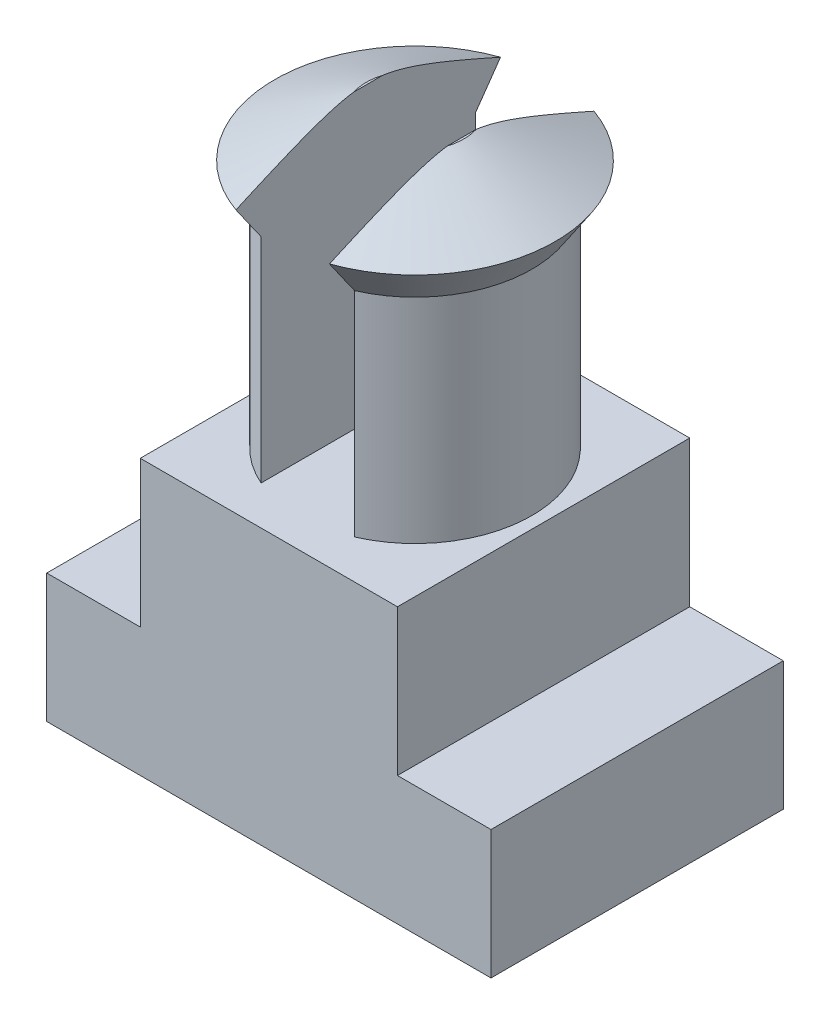
ISO-10303-21;
HEADER;
FILE_DESCRIPTION(('STEP AP214'),'2;1');
FILE_NAME('part.step','',(''),(''),'','','');
FILE_SCHEMA(('AUTOMOTIVE_DESIGN { 1 0 10303 214 1 1 1 1 }'));
ENDSEC;
DATA;
#1=APPLICATION_CONTEXT('core data for automotive mechanical design processes');
#2=APPLICATION_PROTOCOL_DEFINITION('international standard','automotive_design',2000,#1);
#3=PRODUCT_CONTEXT('',#1,'mechanical');
#4=PRODUCT('Part','Part','',(#3));
#5=PRODUCT_RELATED_PRODUCT_CATEGORY('part','',(#4));
#6=PRODUCT_DEFINITION_FORMATION('','',#4);
#7=PRODUCT_DEFINITION_CONTEXT('part definition',#1,'design');
#8=PRODUCT_DEFINITION('design','',#6,#7);
#9=PRODUCT_DEFINITION_SHAPE('','',#8);
#10=(LENGTH_UNIT() NAMED_UNIT(*) SI_UNIT(.MILLI.,.METRE.));
#11=(NAMED_UNIT(*) PLANE_ANGLE_UNIT() SI_UNIT($,.RADIAN.));
#12=(NAMED_UNIT(*) SI_UNIT($,.STERADIAN.) SOLID_ANGLE_UNIT());
#13=UNCERTAINTY_MEASURE_WITH_UNIT(LENGTH_MEASURE(1.E-05),#10,'distance_accuracy_value','');
#14=(GEOMETRIC_REPRESENTATION_CONTEXT(3) GLOBAL_UNCERTAINTY_ASSIGNED_CONTEXT((#13)) GLOBAL_UNIT_ASSIGNED_CONTEXT((#10,
#11,#12)) REPRESENTATION_CONTEXT('',''));
#15=CARTESIAN_POINT('',(0.,0.,0.));
#16=DIRECTION('',(0.,0.,1.));
#17=DIRECTION('',(1.,0.,0.));
#18=AXIS2_PLACEMENT_3D('',#15,#16,#17);
#19=CARTESIAN_POINT('',(4.826,5.969,0.));
#20=DIRECTION('',(0.,-1.,0.));
#21=DIRECTION('',(0.,0.,-1.));
#22=AXIS2_PLACEMENT_3D('',#19,#20,#21);
#23=CYLINDRICAL_SURFACE('',#22,2.54);
#24=CARTESIAN_POINT('',(4.826,10.6045,0.));
#25=DIRECTION('',(0.,-1.,0.));
#26=DIRECTION('',(0.,0.,-1.));
#27=AXIS2_PLACEMENT_3D('',#24,#25,#26);
#28=CIRCLE('',#27,2.54);
#29=CARTESIAN_POINT('',(5.842,10.6045,-2.32794845303757));
#30=VERTEX_POINT('',#29);
#31=CARTESIAN_POINT('',(5.842,10.6045,2.32794845303757));
#32=VERTEX_POINT('',#31);
#33=EDGE_CURVE('E206',#30,#32,#28,.T.);
#34=ORIENTED_EDGE('',*,*,#33,.T.);
#35=DIRECTION('',(0.,-1.,0.));
#36=VECTOR('',#35,1.);
#37=CARTESIAN_POINT('',(5.842,5.969,2.32794845303757));
#38=LINE('',#37,#36);
#39=CARTESIAN_POINT('',(5.842,5.969,2.32794845303757));
#40=VERTEX_POINT('',#39);
#41=EDGE_CURVE('E195',#32,#40,#38,.T.);
#42=ORIENTED_EDGE('',*,*,#41,.T.);
#43=CARTESIAN_POINT('',(4.826,5.969,0.));
#44=DIRECTION('',(0.,-1.,0.));
#45=DIRECTION('',(0.,0.,-1.));
#46=AXIS2_PLACEMENT_3D('',#43,#44,#45);
#47=CIRCLE('',#46,2.54);
#48=CARTESIAN_POINT('',(5.842,5.969,-2.32794845303757));
#49=VERTEX_POINT('',#48);
#50=EDGE_CURVE('E155',#49,#40,#47,.T.);
#51=ORIENTED_EDGE('',*,*,#50,.F.);
#52=DIRECTION('',(0.,-1.,0.));
#53=VECTOR('',#52,1.);
#54=CARTESIAN_POINT('',(5.842,5.969,-2.32794845303757));
#55=LINE('',#54,#53);
#56=EDGE_CURVE('E196',#49,#30,#55,.F.);
#57=ORIENTED_EDGE('',*,*,#56,.T.);
#58=EDGE_LOOP('',(#34,#42,#51,#57));
#59=FACE_BOUND('',#58,.T.);
#60=ADVANCED_FACE('F39',(#59),#23,.T.);
#61=CARTESIAN_POINT('',(4.826,11.3804812503924,0.));
#62=DIRECTION('',(0.,1.,0.));
#63=DIRECTION('',(0.,0.,1.));
#64=AXIS2_PLACEMENT_3D('',#61,#62,#63);
#65=CONICAL_SURFACE('',#64,3.048,0.579640665928093);
#66=CARTESIAN_POINT('',(4.826,11.3804812503924,0.));
#67=DIRECTION('',(0.,-1.,0.));
#68=DIRECTION('',(0.,0.,-1.));
#69=AXIS2_PLACEMENT_3D('',#66,#67,#68);
#70=CIRCLE('',#69,3.048);
#71=CARTESIAN_POINT('',(5.842,11.3804812503924,-2.87368195874213));
#72=VERTEX_POINT('',#71);
#73=CARTESIAN_POINT('',(5.842,11.3804812503924,2.87368195874213));
#74=VERTEX_POINT('',#73);
#75=EDGE_CURVE('E205',#72,#74,#70,.T.);
#76=ORIENTED_EDGE('',*,*,#75,.T.);
#77=CARTESIAN_POINT('',(5.842,11.3811812503924,2.87416801070969));
#78=CARTESIAN_POINT('',(5.842,11.2937430928275,2.81345351359968));
#79=CARTESIAN_POINT('',(5.842,11.2064033121465,2.75259787000958));
#80=CARTESIAN_POINT('',(5.842,11.0319659141862,2.63053603688743));
#81=CARTESIAN_POINT('',(5.842,10.9448683029176,2.56932983876808));
#82=CARTESIAN_POINT('',(5.842,10.683821494054,2.38495205207829));
#83=CARTESIAN_POINT('',(5.842,10.5103114048484,2.26115490095981));
#84=CARTESIAN_POINT('',(5.842,10.2489333358216,2.07166373403736));
#85=CARTESIAN_POINT('',(5.842,10.1603695963954,2.00692994088192));
#86=CARTESIAN_POINT('',(5.842,9.98391243494237,1.8765561166378));
#87=CARTESIAN_POINT('',(5.842,9.89601900133269,1.81091610126398));
#88=CARTESIAN_POINT('',(5.842,9.72118720453258,1.67846897460737));
#89=CARTESIAN_POINT('',(5.842,9.63424836018419,1.61166249983576));
#90=CARTESIAN_POINT('',(5.842,9.4616565011469,1.47641293947943));
#91=CARTESIAN_POINT('',(5.842,9.37600338298896,1.40796998675244));
#92=CARTESIAN_POINT('',(5.842,9.22835811364797,1.28661318364512));
#93=CARTESIAN_POINT('',(5.842,9.16593656388572,1.23422331306008));
#94=CARTESIAN_POINT('',(5.842,9.0425560015621,1.1276784887752));
#95=CARTESIAN_POINT('',(5.842,8.98159768894204,1.07352271845807));
#96=CARTESIAN_POINT('',(5.842,8.86223821544761,0.963136666078018));
#97=CARTESIAN_POINT('',(5.842,8.80382411431093,0.906920471949413));
#98=CARTESIAN_POINT('',(5.842,8.69041948713119,0.791165287316921));
#99=CARTESIAN_POINT('',(5.842,8.63542575448466,0.731629511375724));
#100=CARTESIAN_POINT('',(5.842,8.54715113353425,0.626595136933948));
#101=CARTESIAN_POINT('',(5.842,8.51237398065808,0.582372988912369));
#102=CARTESIAN_POINT('',(5.842,8.44699124706487,0.49074162642644));
#103=CARTESIAN_POINT('',(5.842,8.41639528993265,0.443325422500051));
#104=CARTESIAN_POINT('',(5.842,8.3613757618855,0.343655513722808));
#105=CARTESIAN_POINT('',(5.842,8.33707763212002,0.291328214534618));
#106=CARTESIAN_POINT('',(5.842,8.30887877361888,0.210083587394913));
#107=CARTESIAN_POINT('',(5.842,8.30086182196004,0.182601481346262));
#108=CARTESIAN_POINT('',(5.842,8.28805046398275,0.126906590329336));
#109=CARTESIAN_POINT('',(5.842,8.28325358253751,0.0986943839216304));
#110=CARTESIAN_POINT('',(5.842,8.27612128450013,0.030886728671197));
#111=CARTESIAN_POINT('',(5.842,8.27544975240734,-0.00890075946114833));
#112=CARTESIAN_POINT('',(5.842,8.28118529576405,-0.0879348288641458));
#113=CARTESIAN_POINT('',(5.842,8.28759423858431,-0.127181264675743));
#114=CARTESIAN_POINT('',(5.842,8.30945012445415,-0.216111694421217));
#115=CARTESIAN_POINT('',(5.842,8.32708915575657,-0.26524263162961));
#116=CARTESIAN_POINT('',(5.842,8.3697492151698,-0.360247989681236));
#117=CARTESIAN_POINT('',(5.842,8.39480182696169,-0.406107413943879));
#118=CARTESIAN_POINT('',(5.842,8.46076024930822,-0.51266978267417));
#119=CARTESIAN_POINT('',(5.842,8.50398541508686,-0.571903043867218));
#120=CARTESIAN_POINT('',(5.842,8.59582054368402,-0.686102097326208));
#121=CARTESIAN_POINT('',(5.842,8.64444404795528,-0.74105654157401));
#122=CARTESIAN_POINT('',(5.842,8.74556099639781,-0.848514378541095));
#123=CARTESIAN_POINT('',(5.842,8.79809429278485,-0.900979863865508));
#124=CARTESIAN_POINT('',(5.842,8.90525752633175,-1.00355584135168));
#125=CARTESIAN_POINT('',(5.842,8.95988471696029,-1.05366923880323));
#126=CARTESIAN_POINT('',(5.842,9.11114873191836,-1.18832716762505));
#127=CARTESIAN_POINT('',(5.842,9.20925553577792,-1.27121254717088));
#128=CARTESIAN_POINT('',(5.842,9.4079964399635,-1.43391028899564));
#129=CARTESIAN_POINT('',(5.842,9.50863131096992,-1.51372169492155));
#130=CARTESIAN_POINT('',(5.842,9.7116785035344,-1.6713953483683));
#131=CARTESIAN_POINT('',(5.842,9.81409348256069,-1.7492541645526));
#132=CARTESIAN_POINT('',(5.842,10.0199985234036,-1.90350101576025));
#133=CARTESIAN_POINT('',(5.842,10.1234884369936,-1.97988924952901));
#134=CARTESIAN_POINT('',(5.842,10.3227137077663,-2.12537085969966));
#135=CARTESIAN_POINT('',(5.842,10.4183879204228,-2.19454812568792));
#136=CARTESIAN_POINT('',(5.842,10.6102354710183,-2.33221472999728));
#137=CARTESIAN_POINT('',(5.842,10.7064088297158,-2.40070403935429));
#138=CARTESIAN_POINT('',(5.842,10.8988473148061,-2.53693573080637));
#139=CARTESIAN_POINT('',(5.842,10.9951112883497,-2.60467974326354));
#140=CARTESIAN_POINT('',(5.842,11.1879388148419,-2.73972754108189));
#141=CARTESIAN_POINT('',(5.842,11.2845023489719,-2.80703135330302));
#142=CARTESIAN_POINT('',(5.842,11.3811812503924,-2.87416801070969));
#143=B_SPLINE_CURVE_WITH_KNOTS('',3,(#77,#78,#79,#80,#81,#82,#83,#84,#85,#86,#87,#88,#89,#90,
#91,#92,#93,#94,#95,#96,#97,#98,#99,#100,#101,#102,#103,#104,#105,#106,#107,#108,#109,#110,#111,
#112,#113,#114,#115,#116,#117,#118,#119,#120,#121,#122,#123,#124,#125,#126,#127,#128,#129,#130,
#131,#132,#133,#134,#135,#136,#137,#138,#139,#140,#141,#142),.UNSPECIFIED.,.F.,.F.,(4,2,2,2,2,2,
2,2,2,2,2,2,2,2,2,2,2,2,2,2,2,2,2,2,2,2,2,2,2,2,2,2,4),(0.,0.319350196006104,0.638708248672975,
1.27812878335498,1.60722355886593,1.93631263467794,2.26522742312939,2.59411559864793,
2.83857382696774,3.08314675136386,3.32628001746737,3.5691817986144,3.7377867161726,
3.90677338986213,4.0789043665316,4.16462359097545,4.25027685113195,4.36897897017325,
4.48771240262152,4.64339895909547,4.79975856907374,5.01915681481184,5.23911840502718,
5.46175337702622,5.6841056957973,6.06928145767527,6.45457610037571,6.84050612025236,
7.22638361125301,7.58057099128558,7.93477322120012,8.28790651290895,8.64101805241183),.UNSPECIFIED.);
#144=EDGE_CURVE('E311',#74,#32,#143,.T.);
#145=ORIENTED_EDGE('',*,*,#144,.T.);
#146=ORIENTED_EDGE('',*,*,#33,.F.);
#147=EDGE_CURVE('E307',#30,#72,#143,.T.);
#148=ORIENTED_EDGE('',*,*,#147,.T.);
#149=EDGE_LOOP('',(#76,#145,#146,#148));
#150=FACE_BOUND('',#149,.T.);
#151=ADVANCED_FACE('F247',(#150),#65,.T.);
#152=CARTESIAN_POINT('',(4.826,12.319,0.));
#153=DIRECTION('',(0.,-1.,0.));
#154=DIRECTION('',(0.,0.,-1.));
#155=AXIS2_PLACEMENT_3D('',#152,#153,#154);
#156=CONICAL_SURFACE('',#155,1.06380352993122,1.1289836207384);
#157=ORIENTED_EDGE('',*,*,#75,.F.);
#158=CARTESIAN_POINT('',(5.842,11.3797812503924,-2.87525160882891));
#159=CARTESIAN_POINT('',(5.842,11.4148578710153,-2.79658769749822));
#160=CARTESIAN_POINT('',(5.842,11.4498098668399,-2.71786775586673));
#161=CARTESIAN_POINT('',(5.842,11.519375545832,-2.56027756916402));
#162=CARTESIAN_POINT('',(5.842,11.5539892252704,-2.48140732244747));
#163=CARTESIAN_POINT('',(5.842,11.6228623307408,-2.32331038031065));
#164=CARTESIAN_POINT('',(5.842,11.6571208360109,-2.24408328313405));
#165=CARTESIAN_POINT('',(5.842,11.7250726072754,-2.08538582871036));
#166=CARTESIAN_POINT('',(5.842,11.7587658682106,-2.00591546929348));
#167=CARTESIAN_POINT('',(5.842,11.8278721465587,-1.84073773539755));
#168=CARTESIAN_POINT('',(5.842,11.8632268152477,-1.75500587510974));
#169=CARTESIAN_POINT('',(5.842,11.9327046287167,-1.58304516230339));
#170=CARTESIAN_POINT('',(5.842,11.9668278125262,-1.49681632563609));
#171=CARTESIAN_POINT('',(5.842,12.0332484445713,-1.3237477278445));
#172=CARTESIAN_POINT('',(5.842,12.0655475965046,-1.2369086249398));
#173=CARTESIAN_POINT('',(5.842,12.1274574996447,-1.06224133881124));
#174=CARTESIAN_POINT('',(5.842,12.1570676876727,-0.974412952700807));
#175=CARTESIAN_POINT('',(5.842,12.2080197975583,-0.81049560214201));
#176=CARTESIAN_POINT('',(5.842,12.2299369991471,-0.734588380372099));
#177=CARTESIAN_POINT('',(5.842,12.2692665777364,-0.58163618053712));
#178=CARTESIAN_POINT('',(5.842,12.2866820067487,-0.50459201093124));
#179=CARTESIAN_POINT('',(5.842,12.3148320994506,-0.350907142789266));
#180=CARTESIAN_POINT('',(5.842,12.3256989339138,-0.274291736414112));
#181=CARTESIAN_POINT('',(5.842,12.3395627534811,-0.120367488563187));
#182=CARTESIAN_POINT('',(5.842,12.3425657322972,-0.0430592203010383));
#183=CARTESIAN_POINT('',(5.842,12.3401049559962,0.111886435275741));
#184=CARTESIAN_POINT('',(5.842,12.3345893558103,0.189522947339681));
#185=CARTESIAN_POINT('',(5.842,12.3160656174265,0.343914929439504));
#186=CARTESIAN_POINT('',(5.842,12.3030507327096,0.420669542601139));
#187=CARTESIAN_POINT('',(5.842,12.2710743305129,0.574601482661408));
#188=CARTESIAN_POINT('',(5.842,12.2519912247148,0.65175255047283));
#189=CARTESIAN_POINT('',(5.842,12.2097715732669,0.804954746299354));
#190=CARTESIAN_POINT('',(5.842,12.1866327617761,0.881005233594822));
#191=CARTESIAN_POINT('',(5.842,12.1345736408655,1.04156497914603));
#192=CARTESIAN_POINT('',(5.842,12.1052922157633,1.12595547839691));
#193=CARTESIAN_POINT('',(5.842,12.044460042711,1.29388514575467));
#194=CARTESIAN_POINT('',(5.842,12.0129097420777,1.37742447798442));
#195=CARTESIAN_POINT('',(5.842,11.9482411117081,1.54396539969459));
#196=CARTESIAN_POINT('',(5.842,11.9151215795298,1.62696651953728));
#197=CARTESIAN_POINT('',(5.842,11.8477977277604,1.79252862778497));
#198=CARTESIAN_POINT('',(5.842,11.8135933741461,1.87508960229067));
#199=CARTESIAN_POINT('',(5.842,11.7143841232767,2.111425927219));
#200=CARTESIAN_POINT('',(5.842,11.6484202593615,2.26479799693499));
#201=CARTESIAN_POINT('',(5.842,11.5483706406398,2.49421579987554));
#202=CARTESIAN_POINT('',(5.842,11.514865649762,2.57051730919712));
#203=CARTESIAN_POINT('',(5.842,11.4475414313361,2.72298105424714));
#204=CARTESIAN_POINT('',(5.842,11.4137222057647,2.79914329084807));
#205=CARTESIAN_POINT('',(5.842,11.3797812503924,2.87525160882891));
#206=B_SPLINE_CURVE_WITH_KNOTS('',3,(#158,#159,#160,#161,#162,#163,#164,#165,#166,#167,#168,
#169,#170,#171,#172,#173,#174,#175,#176,#177,#178,#179,#180,#181,#182,#183,#184,#185,#186,#187,
#188,#189,#190,#191,#192,#193,#194,#195,#196,#197,#198,#199,#200,#201,#202,#203,#204,#205),
.UNSPECIFIED.,.F.,.F.,(4,2,2,2,2,2,2,2,2,2,2,2,2,2,2,2,2,2,2,2,2,2,2,4),(0.,0.258390578281944,
0.516784001487421,0.775732516121167,1.03468334723917,1.31288393639803,1.59107570081887,
1.869003175948,2.14698872683465,2.38392259281447,2.62069540382926,2.85251369592627,
3.08415524812441,3.31721216335716,3.55047906971493,3.78875047014309,4.02715541477883,
4.29508343169943,4.5629587697207,4.83104279909052,5.09913524468802,5.59998374460687,
5.84998473450169,6.09998415284586),.UNSPECIFIED.);
#207=CARTESIAN_POINT('',(5.842,12.319,-0.315312464539752));
#208=VERTEX_POINT('',#207);
#209=EDGE_CURVE('E328',#72,#208,#206,.T.);
#210=ORIENTED_EDGE('',*,*,#209,.T.);
#211=CARTESIAN_POINT('',(4.826,12.319,0.));
#212=DIRECTION('',(0.,-1.,0.));
#213=DIRECTION('',(0.,0.,-1.));
#214=AXIS2_PLACEMENT_3D('',#211,#212,#213);
#215=CIRCLE('',#214,1.06380352993122);
#216=CARTESIAN_POINT('',(5.842,12.319,0.315312464539752));
#217=VERTEX_POINT('',#216);
#218=EDGE_CURVE('E194',#208,#217,#215,.T.);
#219=ORIENTED_EDGE('',*,*,#218,.T.);
#220=EDGE_CURVE('E329',#217,#74,#206,.T.);
#221=ORIENTED_EDGE('',*,*,#220,.T.);
#222=EDGE_LOOP('',(#157,#210,#219,#221));
#223=FACE_BOUND('',#222,.T.);
#224=ADVANCED_FACE('F255',(#223),#156,.T.);
#225=CARTESIAN_POINT('',(3.76219647006878,12.319,0.));
#226=DIRECTION('',(0.,-1.,0.));
#227=DIRECTION('',(0.,0.,-1.));
#228=AXIS2_PLACEMENT_3D('',#225,#226,#227);
#229=PLANE('',#228);
#230=ORIENTED_EDGE('',*,*,#218,.F.);
#231=DIRECTION('',(0.,0.,1.));
#232=VECTOR('',#231,1.);
#233=CARTESIAN_POINT('',(5.842,12.319,0.));
#234=LINE('',#233,#232);
#235=EDGE_CURVE('E11',#208,#217,#234,.T.);
#236=ORIENTED_EDGE('',*,*,#235,.T.);
#237=EDGE_LOOP('',(#230,#236));
#238=FACE_BOUND('',#237,.T.);
#239=ADVANCED_FACE('F347',(#238),#229,.F.);
#240=CARTESIAN_POINT('',(0.,0.,3.175));
#241=DIRECTION('',(1.,0.,0.));
#242=DIRECTION('',(0.,0.,-1.));
#243=AXIS2_PLACEMENT_3D('',#240,#241,#242);
#244=PLANE('',#243);
#245=DIRECTION('',(0.,-1.,0.));
#246=VECTOR('',#245,1.);
#247=CARTESIAN_POINT('',(0.,0.,-3.175));
#248=LINE('',#247,#246);
#249=CARTESIAN_POINT('',(0.,2.794,-3.175));
#250=VERTEX_POINT('',#249);
#251=CARTESIAN_POINT('',(0.,0.,-3.175));
#252=VERTEX_POINT('',#251);
#253=EDGE_CURVE('E146',#250,#252,#248,.T.);
#254=ORIENTED_EDGE('',*,*,#253,.T.);
#255=DIRECTION('',(0.,0.,-1.));
#256=VECTOR('',#255,1.);
#257=CARTESIAN_POINT('',(0.,0.,3.175));
#258=LINE('',#257,#256);
#259=CARTESIAN_POINT('',(0.,0.,3.175));
#260=VERTEX_POINT('',#259);
#261=EDGE_CURVE('E179',#260,#252,#258,.T.);
#262=ORIENTED_EDGE('',*,*,#261,.F.);
#263=DIRECTION('',(0.,-1.,0.));
#264=VECTOR('',#263,1.);
#265=CARTESIAN_POINT('',(0.,0.,3.175));
#266=LINE('',#265,#264);
#267=CARTESIAN_POINT('',(0.,2.794,3.175));
#268=VERTEX_POINT('',#267);
#269=EDGE_CURVE('E163',#268,#260,#266,.T.);
#270=ORIENTED_EDGE('',*,*,#269,.F.);
#271=DIRECTION('',(0.,0.,-1.));
#272=VECTOR('',#271,1.);
#273=CARTESIAN_POINT('',(0.,2.794,3.175));
#274=LINE('',#273,#272);
#275=EDGE_CURVE('E145',#268,#250,#274,.T.);
#276=ORIENTED_EDGE('',*,*,#275,.T.);
#277=EDGE_LOOP('',(#254,#262,#270,#276));
#278=FACE_BOUND('',#277,.T.);
#279=ADVANCED_FACE('F41',(#278),#244,.F.);
#280=CARTESIAN_POINT('',(0.,0.,3.175));
#281=DIRECTION('',(0.,1.,0.));
#282=DIRECTION('',(0.,0.,1.));
#283=AXIS2_PLACEMENT_3D('',#280,#281,#282);
#284=PLANE('',#283);
#285=DIRECTION('',(1.,0.,0.));
#286=VECTOR('',#285,1.);
#287=CARTESIAN_POINT('',(0.,0.,-3.175));
#288=LINE('',#287,#286);
#289=CARTESIAN_POINT('',(9.652,0.,-3.175));
#290=VERTEX_POINT('',#289);
#291=EDGE_CURVE('E151',#252,#290,#288,.T.);
#292=ORIENTED_EDGE('',*,*,#291,.T.);
#293=DIRECTION('',(0.,0.,-1.));
#294=VECTOR('',#293,1.);
#295=CARTESIAN_POINT('',(9.652,0.,3.175));
#296=LINE('',#295,#294);
#297=CARTESIAN_POINT('',(9.652,0.,3.175));
#298=VERTEX_POINT('',#297);
#299=EDGE_CURVE('E173',#298,#290,#296,.T.);
#300=ORIENTED_EDGE('',*,*,#299,.F.);
#301=DIRECTION('',(1.,0.,0.));
#302=VECTOR('',#301,1.);
#303=CARTESIAN_POINT('',(0.,0.,3.175));
#304=LINE('',#303,#302);
#305=EDGE_CURVE('E104',#260,#298,#304,.T.);
#306=ORIENTED_EDGE('',*,*,#305,.F.);
#307=ORIENTED_EDGE('',*,*,#261,.T.);
#308=EDGE_LOOP('',(#292,#300,#306,#307));
#309=FACE_BOUND('',#308,.T.);
#310=ADVANCED_FACE('F231',(#309),#284,.F.);
#311=CARTESIAN_POINT('',(9.652,2.794,3.175));
#312=DIRECTION('',(-1.,0.,0.));
#313=DIRECTION('',(0.,0.,1.));
#314=AXIS2_PLACEMENT_3D('',#311,#312,#313);
#315=PLANE('',#314);
#316=DIRECTION('',(0.,1.,0.));
#317=VECTOR('',#316,1.);
#318=CARTESIAN_POINT('',(9.652,2.794,-3.175));
#319=LINE('',#318,#317);
#320=CARTESIAN_POINT('',(9.652,2.794,-3.175));
#321=VERTEX_POINT('',#320);
#322=EDGE_CURVE('E152',#290,#321,#319,.T.);
#323=ORIENTED_EDGE('',*,*,#322,.T.);
#324=DIRECTION('',(0.,0.,-1.));
#325=VECTOR('',#324,1.);
#326=CARTESIAN_POINT('',(9.652,2.794,3.175));
#327=LINE('',#326,#325);
#328=CARTESIAN_POINT('',(9.652,2.794,3.175));
#329=VERTEX_POINT('',#328);
#330=EDGE_CURVE('E171',#329,#321,#327,.T.);
#331=ORIENTED_EDGE('',*,*,#330,.F.);
#332=DIRECTION('',(0.,1.,0.));
#333=VECTOR('',#332,1.);
#334=CARTESIAN_POINT('',(9.652,2.794,3.175));
#335=LINE('',#334,#333);
#336=EDGE_CURVE('E212',#298,#329,#335,.T.);
#337=ORIENTED_EDGE('',*,*,#336,.F.);
#338=ORIENTED_EDGE('',*,*,#299,.T.);
#339=EDGE_LOOP('',(#323,#331,#337,#338));
#340=FACE_BOUND('',#339,.T.);
#341=ADVANCED_FACE('F240',(#340),#315,.F.);
#342=CARTESIAN_POINT('',(7.62,2.794,3.175));
#343=DIRECTION('',(0.,-1.,0.));
#344=DIRECTION('',(0.,0.,-1.));
#345=AXIS2_PLACEMENT_3D('',#342,#343,#344);
#346=PLANE('',#345);
#347=DIRECTION('',(-1.,0.,0.));
#348=VECTOR('',#347,1.);
#349=CARTESIAN_POINT('',(7.62,2.794,-3.175));
#350=LINE('',#349,#348);
#351=CARTESIAN_POINT('',(7.62,2.794,-3.175));
#352=VERTEX_POINT('',#351);
#353=EDGE_CURVE('E156',#321,#352,#350,.T.);
#354=ORIENTED_EDGE('',*,*,#353,.T.);
#355=DIRECTION('',(0.,0.,-1.));
#356=VECTOR('',#355,1.);
#357=CARTESIAN_POINT('',(7.62,2.794,3.175));
#358=LINE('',#357,#356);
#359=CARTESIAN_POINT('',(7.62,2.794,3.175));
#360=VERTEX_POINT('',#359);
#361=EDGE_CURVE('E169',#360,#352,#358,.T.);
#362=ORIENTED_EDGE('',*,*,#361,.F.);
#363=DIRECTION('',(-1.,0.,0.));
#364=VECTOR('',#363,1.);
#365=CARTESIAN_POINT('',(7.62,2.794,3.175));
#366=LINE('',#365,#364);
#367=EDGE_CURVE('E216',#329,#360,#366,.T.);
#368=ORIENTED_EDGE('',*,*,#367,.F.);
#369=ORIENTED_EDGE('',*,*,#330,.T.);
#370=EDGE_LOOP('',(#354,#362,#368,#369));
#371=FACE_BOUND('',#370,.T.);
#372=ADVANCED_FACE('F225',(#371),#346,.F.);
#373=CARTESIAN_POINT('',(7.62,5.969,3.175));
#374=DIRECTION('',(-1.,0.,0.));
#375=DIRECTION('',(0.,0.,1.));
#376=AXIS2_PLACEMENT_3D('',#373,#374,#375);
#377=PLANE('',#376);
#378=DIRECTION('',(0.,1.,0.));
#379=VECTOR('',#378,1.);
#380=CARTESIAN_POINT('',(7.62,5.969,-3.175));
#381=LINE('',#380,#379);
#382=CARTESIAN_POINT('',(7.62,5.969,-3.175));
#383=VERTEX_POINT('',#382);
#384=EDGE_CURVE('E158',#352,#383,#381,.T.);
#385=ORIENTED_EDGE('',*,*,#384,.T.);
#386=DIRECTION('',(0.,0.,-1.));
#387=VECTOR('',#386,1.);
#388=CARTESIAN_POINT('',(7.62,5.969,3.175));
#389=LINE('',#388,#387);
#390=CARTESIAN_POINT('',(7.62,5.969,3.175));
#391=VERTEX_POINT('',#390);
#392=EDGE_CURVE('E136',#391,#383,#389,.T.);
#393=ORIENTED_EDGE('',*,*,#392,.F.);
#394=DIRECTION('',(0.,1.,0.));
#395=VECTOR('',#394,1.);
#396=CARTESIAN_POINT('',(7.62,5.969,3.175));
#397=LINE('',#396,#395);
#398=EDGE_CURVE('E130',#360,#391,#397,.T.);
#399=ORIENTED_EDGE('',*,*,#398,.F.);
#400=ORIENTED_EDGE('',*,*,#361,.T.);
#401=EDGE_LOOP('',(#385,#393,#399,#400));
#402=FACE_BOUND('',#401,.T.);
#403=ADVANCED_FACE('F226',(#402),#377,.F.);
#404=CARTESIAN_POINT('',(2.032,5.969,3.175));
#405=DIRECTION('',(0.,-1.,0.));
#406=DIRECTION('',(0.,0.,-1.));
#407=AXIS2_PLACEMENT_3D('',#404,#405,#406);
#408=PLANE('',#407);
#409=DIRECTION('',(0.,0.,1.));
#410=VECTOR('',#409,1.);
#411=CARTESIAN_POINT('',(3.81,5.969,-3.175));
#412=LINE('',#411,#410);
#413=CARTESIAN_POINT('',(3.81,5.969,-2.32794845303757));
#414=VERTEX_POINT('',#413);
#415=CARTESIAN_POINT('',(3.81,5.969,2.32794845303757));
#416=VERTEX_POINT('',#415);
#417=EDGE_CURVE('E359',#414,#416,#412,.T.);
#418=ORIENTED_EDGE('',*,*,#417,.T.);
#419=EDGE_CURVE('E207',#416,#414,#47,.T.);
#420=ORIENTED_EDGE('',*,*,#419,.T.);
#421=EDGE_LOOP('',(#418,#420));
#422=FACE_BOUND('',#421,.T.);
#423=ORIENTED_EDGE('',*,*,#50,.T.);
#424=DIRECTION('',(0.,0.,1.));
#425=VECTOR('',#424,1.);
#426=CARTESIAN_POINT('',(5.842,5.969,-3.175));
#427=LINE('',#426,#425);
#428=EDGE_CURVE('E320',#49,#40,#427,.T.);
#429=ORIENTED_EDGE('',*,*,#428,.F.);
#430=EDGE_LOOP('',(#423,#429));
#431=FACE_BOUND('',#430,.T.);
#432=DIRECTION('',(-1.,0.,0.));
#433=VECTOR('',#432,1.);
#434=CARTESIAN_POINT('',(2.032,5.969,-3.175));
#435=LINE('',#434,#433);
#436=CARTESIAN_POINT('',(2.032,5.969,-3.175));
#437=VERTEX_POINT('',#436);
#438=EDGE_CURVE('E137',#383,#437,#435,.T.);
#439=ORIENTED_EDGE('',*,*,#438,.T.);
#440=DIRECTION('',(0.,0.,-1.));
#441=VECTOR('',#440,1.);
#442=CARTESIAN_POINT('',(2.032,5.969,3.175));
#443=LINE('',#442,#441);
#444=CARTESIAN_POINT('',(2.032,5.969,3.175));
#445=VERTEX_POINT('',#444);
#446=EDGE_CURVE('E134',#445,#437,#443,.T.);
#447=ORIENTED_EDGE('',*,*,#446,.F.);
#448=DIRECTION('',(-1.,0.,0.));
#449=VECTOR('',#448,1.);
#450=CARTESIAN_POINT('',(2.032,5.969,3.175));
#451=LINE('',#450,#449);
#452=EDGE_CURVE('E120',#391,#445,#451,.T.);
#453=ORIENTED_EDGE('',*,*,#452,.F.);
#454=ORIENTED_EDGE('',*,*,#392,.T.);
#455=EDGE_LOOP('',(#439,#447,#453,#454));
#456=FACE_BOUND('',#455,.T.);
#457=ADVANCED_FACE('F133',(#422,#431,#456),#408,.F.);
#458=CARTESIAN_POINT('',(2.032,2.794,3.175));
#459=DIRECTION('',(1.,0.,0.));
#460=DIRECTION('',(0.,0.,-1.));
#461=AXIS2_PLACEMENT_3D('',#458,#459,#460);
#462=PLANE('',#461);
#463=DIRECTION('',(0.,-1.,0.));
#464=VECTOR('',#463,1.);
#465=CARTESIAN_POINT('',(2.032,2.794,-3.175));
#466=LINE('',#465,#464);
#467=CARTESIAN_POINT('',(2.032,2.794,-3.175));
#468=VERTEX_POINT('',#467);
#469=EDGE_CURVE('E161',#437,#468,#466,.T.);
#470=ORIENTED_EDGE('',*,*,#469,.T.);
#471=DIRECTION('',(0.,0.,-1.));
#472=VECTOR('',#471,1.);
#473=CARTESIAN_POINT('',(2.032,2.794,3.175));
#474=LINE('',#473,#472);
#475=CARTESIAN_POINT('',(2.032,2.794,3.175));
#476=VERTEX_POINT('',#475);
#477=EDGE_CURVE('E138',#476,#468,#474,.T.);
#478=ORIENTED_EDGE('',*,*,#477,.F.);
#479=DIRECTION('',(0.,-1.,0.));
#480=VECTOR('',#479,1.);
#481=CARTESIAN_POINT('',(2.032,2.794,3.175));
#482=LINE('',#481,#480);
#483=EDGE_CURVE('E121',#445,#476,#482,.T.);
#484=ORIENTED_EDGE('',*,*,#483,.F.);
#485=ORIENTED_EDGE('',*,*,#446,.T.);
#486=EDGE_LOOP('',(#470,#478,#484,#485));
#487=FACE_BOUND('',#486,.T.);
#488=ADVANCED_FACE('F142',(#487),#462,.F.);
#489=CARTESIAN_POINT('',(0.,2.794,3.175));
#490=DIRECTION('',(0.,-1.,0.));
#491=DIRECTION('',(0.,0.,-1.));
#492=AXIS2_PLACEMENT_3D('',#489,#490,#491);
#493=PLANE('',#492);
#494=DIRECTION('',(-1.,0.,0.));
#495=VECTOR('',#494,1.);
#496=CARTESIAN_POINT('',(0.,2.794,-3.175));
#497=LINE('',#496,#495);
#498=EDGE_CURVE('E96',#468,#250,#497,.T.);
#499=ORIENTED_EDGE('',*,*,#498,.T.);
#500=ORIENTED_EDGE('',*,*,#275,.F.);
#501=DIRECTION('',(-1.,0.,0.));
#502=VECTOR('',#501,1.);
#503=CARTESIAN_POINT('',(0.,2.794,3.175));
#504=LINE('',#503,#502);
#505=EDGE_CURVE('E64',#476,#268,#504,.T.);
#506=ORIENTED_EDGE('',*,*,#505,.F.);
#507=ORIENTED_EDGE('',*,*,#477,.T.);
#508=EDGE_LOOP('',(#499,#500,#506,#507));
#509=FACE_BOUND('',#508,.T.);
#510=ADVANCED_FACE('F230',(#509),#493,.F.);
#511=CARTESIAN_POINT('',(0.,0.,3.175));
#512=DIRECTION('',(0.,0.,-1.));
#513=DIRECTION('',(-1.,0.,0.));
#514=AXIS2_PLACEMENT_3D('',#511,#512,#513);
#515=PLANE('',#514);
#516=ORIENTED_EDGE('',*,*,#269,.T.);
#517=ORIENTED_EDGE('',*,*,#305,.T.);
#518=ORIENTED_EDGE('',*,*,#336,.T.);
#519=ORIENTED_EDGE('',*,*,#367,.T.);
#520=ORIENTED_EDGE('',*,*,#398,.T.);
#521=ORIENTED_EDGE('',*,*,#452,.T.);
#522=ORIENTED_EDGE('',*,*,#483,.T.);
#523=ORIENTED_EDGE('',*,*,#505,.T.);
#524=EDGE_LOOP('',(#516,#517,#518,#519,#520,#521,#522,#523));
#525=FACE_BOUND('',#524,.T.);
#526=ADVANCED_FACE('F124',(#525),#515,.F.);
#527=CARTESIAN_POINT('',(0.,0.,-3.175));
#528=DIRECTION('',(0.,0.,-1.));
#529=DIRECTION('',(-1.,0.,0.));
#530=AXIS2_PLACEMENT_3D('',#527,#528,#529);
#531=PLANE('',#530);
#532=ORIENTED_EDGE('',*,*,#253,.F.);
#533=ORIENTED_EDGE('',*,*,#498,.F.);
#534=ORIENTED_EDGE('',*,*,#469,.F.);
#535=ORIENTED_EDGE('',*,*,#438,.F.);
#536=ORIENTED_EDGE('',*,*,#384,.F.);
#537=ORIENTED_EDGE('',*,*,#353,.F.);
#538=ORIENTED_EDGE('',*,*,#322,.F.);
#539=ORIENTED_EDGE('',*,*,#291,.F.);
#540=EDGE_LOOP('',(#532,#533,#534,#535,#536,#537,#538,#539));
#541=FACE_BOUND('',#540,.T.);
#542=ADVANCED_FACE('F228',(#541),#531,.T.);
#543=CARTESIAN_POINT('',(3.81,10.6045,2.32794845303757));
#544=VERTEX_POINT('',#543);
#545=CARTESIAN_POINT('',(3.81,10.6045,-2.32794845303757));
#546=VERTEX_POINT('',#545);
#547=EDGE_CURVE('E202',#544,#546,#28,.T.);
#548=ORIENTED_EDGE('',*,*,#547,.T.);
#549=DIRECTION('',(0.,-1.,0.));
#550=VECTOR('',#549,1.);
#551=CARTESIAN_POINT('',(3.81,5.969,-2.32794845303757));
#552=LINE('',#551,#550);
#553=EDGE_CURVE('E274',#546,#414,#552,.T.);
#554=ORIENTED_EDGE('',*,*,#553,.T.);
#555=ORIENTED_EDGE('',*,*,#419,.F.);
#556=DIRECTION('',(0.,-1.,0.));
#557=VECTOR('',#556,1.);
#558=CARTESIAN_POINT('',(3.81,5.969,2.32794845303757));
#559=LINE('',#558,#557);
#560=EDGE_CURVE('E276',#416,#544,#559,.F.);
#561=ORIENTED_EDGE('',*,*,#560,.T.);
#562=EDGE_LOOP('',(#548,#554,#555,#561));
#563=FACE_BOUND('',#562,.T.);
#564=ADVANCED_FACE('F246',(#563),#23,.T.);
#565=CARTESIAN_POINT('',(3.81,11.3804812503924,2.87368195874213));
#566=VERTEX_POINT('',#565);
#567=CARTESIAN_POINT('',(3.81,11.3804812503924,-2.87368195874213));
#568=VERTEX_POINT('',#567);
#569=EDGE_CURVE('E198',#566,#568,#70,.T.);
#570=ORIENTED_EDGE('',*,*,#569,.T.);
#571=CARTESIAN_POINT('',(3.81,11.3811812503924,-2.87416801070969));
#572=CARTESIAN_POINT('',(3.81,11.2937430928275,-2.81345351359968));
#573=CARTESIAN_POINT('',(3.81,11.2064033121465,-2.75259787000958));
#574=CARTESIAN_POINT('',(3.81,11.0319659141862,-2.63053603688743));
#575=CARTESIAN_POINT('',(3.81,10.9448683029176,-2.56932983876808));
#576=CARTESIAN_POINT('',(3.81,10.683821494054,-2.38495205207829));
#577=CARTESIAN_POINT('',(3.81,10.5103114048484,-2.26115490095981));
#578=CARTESIAN_POINT('',(3.81,10.2489333358216,-2.07166373403736));
#579=CARTESIAN_POINT('',(3.81,10.1603695963954,-2.00692994088192));
#580=CARTESIAN_POINT('',(3.81,9.98391243494238,-1.8765561166378));
#581=CARTESIAN_POINT('',(3.81,9.89601900133269,-1.81091610126398));
#582=CARTESIAN_POINT('',(3.81,9.72118720453258,-1.67846897460737));
#583=CARTESIAN_POINT('',(3.81,9.63424836018419,-1.61166249983576));
#584=CARTESIAN_POINT('',(3.81,9.4616565011469,-1.47641293947943));
#585=CARTESIAN_POINT('',(3.81,9.37600338298896,-1.40796998675244));
#586=CARTESIAN_POINT('',(3.81,9.22835811364797,-1.28661318364513));
#587=CARTESIAN_POINT('',(3.81,9.16593656388572,-1.23422331306008));
#588=CARTESIAN_POINT('',(3.81,9.0425560015621,-1.1276784887752));
#589=CARTESIAN_POINT('',(3.81,8.98159768894204,-1.07352271845807));
#590=CARTESIAN_POINT('',(3.81,8.86223821544761,-0.963136666078018));
#591=CARTESIAN_POINT('',(3.81,8.80382411431093,-0.906920471949413));
#592=CARTESIAN_POINT('',(3.81,8.69041948713119,-0.791165287316919));
#593=CARTESIAN_POINT('',(3.81,8.63542575448466,-0.731629511375722));
#594=CARTESIAN_POINT('',(3.81,8.54715113353425,-0.626595136933945));
#595=CARTESIAN_POINT('',(3.81,8.51237398065808,-0.582372988912365));
#596=CARTESIAN_POINT('',(3.81,8.44699124706487,-0.490741626426436));
#597=CARTESIAN_POINT('',(3.81,8.41639528993264,-0.443325422500047));
#598=CARTESIAN_POINT('',(3.81,8.36137576188549,-0.343655513722805));
#599=CARTESIAN_POINT('',(3.81,8.33707763212001,-0.291328214534614));
#600=CARTESIAN_POINT('',(3.81,8.30887877361888,-0.210083587394909));
#601=CARTESIAN_POINT('',(3.81,8.30086182196004,-0.182601481346258));
#602=CARTESIAN_POINT('',(3.81,8.28805046398275,-0.126906590329332));
#603=CARTESIAN_POINT('',(3.81,8.28325358253751,-0.0986943839216263));
#604=CARTESIAN_POINT('',(3.81,8.27612128450013,-0.0308867286711927));
#605=CARTESIAN_POINT('',(3.81,8.27544975240734,0.00890075946115262));
#606=CARTESIAN_POINT('',(3.81,8.28118529576405,0.08793482886415));
#607=CARTESIAN_POINT('',(3.81,8.28759423858431,0.127181264675747));
#608=CARTESIAN_POINT('',(3.81,8.30945012445415,0.216111694421222));
#609=CARTESIAN_POINT('',(3.81,8.32708915575658,0.265242631629614));
#610=CARTESIAN_POINT('',(3.81,8.3697492151698,0.360247989681241));
#611=CARTESIAN_POINT('',(3.81,8.39480182696169,0.406107413943885));
#612=CARTESIAN_POINT('',(3.81,8.46076024930823,0.512669782674177));
#613=CARTESIAN_POINT('',(3.81,8.50398541508687,0.571903043867227));
#614=CARTESIAN_POINT('',(3.81,8.59582054368403,0.686102097326219));
#615=CARTESIAN_POINT('',(3.81,8.64444404795529,0.741056541574022));
#616=CARTESIAN_POINT('',(3.81,8.74556099639782,0.848514378541108));
#617=CARTESIAN_POINT('',(3.81,8.79809429278487,0.900979863865523));
#618=CARTESIAN_POINT('',(3.81,8.90525752633177,1.00355584135169));
#619=CARTESIAN_POINT('',(3.81,8.95988471696031,1.05366923880325));
#620=CARTESIAN_POINT('',(3.81,9.11114873191838,1.18832716762507));
#621=CARTESIAN_POINT('',(3.81,9.20925553577793,1.2712125471709));
#622=CARTESIAN_POINT('',(3.81,9.40799643996352,1.43391028899566));
#623=CARTESIAN_POINT('',(3.81,9.50863131096994,1.51372169492157));
#624=CARTESIAN_POINT('',(3.81,9.71167850353442,1.67139534836831));
#625=CARTESIAN_POINT('',(3.81,9.81409348256071,1.74925416455261));
#626=CARTESIAN_POINT('',(3.81,10.0199985234036,1.90350101576026));
#627=CARTESIAN_POINT('',(3.81,10.1234884369936,1.97988924952902));
#628=CARTESIAN_POINT('',(3.81,10.3227137077663,2.12537085969967));
#629=CARTESIAN_POINT('',(3.81,10.4183879204228,2.19454812568792));
#630=CARTESIAN_POINT('',(3.81,10.6102354710183,2.33221472999728));
#631=CARTESIAN_POINT('',(3.81,10.7064088297158,2.40070403935429));
#632=CARTESIAN_POINT('',(3.81,10.8988473148061,2.53693573080637));
#633=CARTESIAN_POINT('',(3.81,10.9951112883497,2.60467974326354));
#634=CARTESIAN_POINT('',(3.81,11.1879388148419,2.7397275410819));
#635=CARTESIAN_POINT('',(3.81,11.2845023489719,2.80703135330302));
#636=CARTESIAN_POINT('',(3.81,11.3811812503924,2.87416801070969));
#637=B_SPLINE_CURVE_WITH_KNOTS('',3,(#571,#572,#573,#574,#575,#576,#577,#578,#579,#580,#581,
#582,#583,#584,#585,#586,#587,#588,#589,#590,#591,#592,#593,#594,#595,#596,#597,#598,#599,#600,
#601,#602,#603,#604,#605,#606,#607,#608,#609,#610,#611,#612,#613,#614,#615,#616,#617,#618,#619,
#620,#621,#622,#623,#624,#625,#626,#627,#628,#629,#630,#631,#632,#633,#634,#635,#636),
.UNSPECIFIED.,.F.,.F.,(4,2,2,2,2,2,2,2,2,2,2,2,2,2,2,2,2,2,2,2,2,2,2,2,2,2,2,2,2,2,2,2,4),(0.,
0.319350196006104,0.638708248672975,1.27812878335498,1.60722355886593,1.93631263467794,
2.26522742312938,2.59411559864793,2.83857382696774,3.08314675136386,3.32628001746737,
3.56918179861441,3.73778671617261,3.90677338986214,4.07890436653161,4.16462359097545,
4.25027685113195,4.36897897017326,4.48771240262153,4.64339895909548,4.79975856907375,
5.01915681481185,5.2391184050272,5.46175337702624,5.68410569579733,6.0692814576753,
6.45457610037574,6.84050612025238,7.22638361125303,7.58057099128559,7.93477322120013,
8.28790651290895,8.64101805241183),.UNSPECIFIED.);
#638=EDGE_CURVE('E289',#568,#546,#637,.T.);
#639=ORIENTED_EDGE('',*,*,#638,.T.);
#640=ORIENTED_EDGE('',*,*,#547,.F.);
#641=EDGE_CURVE('E287',#544,#566,#637,.T.);
#642=ORIENTED_EDGE('',*,*,#641,.T.);
#643=EDGE_LOOP('',(#570,#639,#640,#642));
#644=FACE_BOUND('',#643,.T.);
#645=ADVANCED_FACE('F260',(#644),#65,.T.);
#646=ORIENTED_EDGE('',*,*,#569,.F.);
#647=CARTESIAN_POINT('',(3.81,11.3797812503924,2.87525160882891));
#648=CARTESIAN_POINT('',(3.81,11.4148578710153,2.79658769749822));
#649=CARTESIAN_POINT('',(3.81,11.4498098668399,2.71786775586673));
#650=CARTESIAN_POINT('',(3.81,11.519375545832,2.56027756916402));
#651=CARTESIAN_POINT('',(3.81,11.5539892252704,2.48140732244748));
#652=CARTESIAN_POINT('',(3.81,11.6228623307408,2.32331038031065));
#653=CARTESIAN_POINT('',(3.81,11.6571208360109,2.24408328313405));
#654=CARTESIAN_POINT('',(3.81,11.7250726072754,2.08538582871036));
#655=CARTESIAN_POINT('',(3.81,11.7587658682106,2.00591546929348));
#656=CARTESIAN_POINT('',(3.81,11.8278721465587,1.84073773539755));
#657=CARTESIAN_POINT('',(3.81,11.8632268152477,1.75500587510974));
#658=CARTESIAN_POINT('',(3.81,11.9327046287167,1.58304516230339));
#659=CARTESIAN_POINT('',(3.81,11.9668278125262,1.49681632563609));
#660=CARTESIAN_POINT('',(3.81,12.0332484445713,1.3237477278445));
#661=CARTESIAN_POINT('',(3.81,12.0655475965046,1.2369086249398));
#662=CARTESIAN_POINT('',(3.81,12.1274574996447,1.06224133881124));
#663=CARTESIAN_POINT('',(3.81,12.1570676876727,0.974412952700807));
#664=CARTESIAN_POINT('',(3.81,12.2080197975583,0.810495602142009));
#665=CARTESIAN_POINT('',(3.81,12.2299369991471,0.734588380372099));
#666=CARTESIAN_POINT('',(3.81,12.2692665777364,0.58163618053712));
#667=CARTESIAN_POINT('',(3.81,12.2866820067487,0.50459201093124));
#668=CARTESIAN_POINT('',(3.81,12.3148320994506,0.350907142789266));
#669=CARTESIAN_POINT('',(3.81,12.3256989339138,0.274291736414111));
#670=CARTESIAN_POINT('',(3.81,12.3395627534811,0.120367488563186));
#671=CARTESIAN_POINT('',(3.81,12.3425657322972,0.0430592203010373));
#672=CARTESIAN_POINT('',(3.81,12.3401049559962,-0.111886435275742));
#673=CARTESIAN_POINT('',(3.81,12.3345893558103,-0.189522947339682));
#674=CARTESIAN_POINT('',(3.81,12.3160656174265,-0.343914929439506));
#675=CARTESIAN_POINT('',(3.81,12.3030507327096,-0.420669542601141));
#676=CARTESIAN_POINT('',(3.81,12.2710743305129,-0.57460148266141));
#677=CARTESIAN_POINT('',(3.81,12.2519912247148,-0.651752550472831));
#678=CARTESIAN_POINT('',(3.81,12.2097715732669,-0.804954746299356));
#679=CARTESIAN_POINT('',(3.81,12.1866327617761,-0.881005233594824));
#680=CARTESIAN_POINT('',(3.81,12.1345736408655,-1.04156497914603));
#681=CARTESIAN_POINT('',(3.81,12.1052922157633,-1.12595547839691));
#682=CARTESIAN_POINT('',(3.81,12.044460042711,-1.29388514575467));
#683=CARTESIAN_POINT('',(3.81,12.0129097420776,-1.37742447798442));
#684=CARTESIAN_POINT('',(3.81,11.948241111708,-1.54396539969459));
#685=CARTESIAN_POINT('',(3.81,11.9151215795298,-1.62696651953728));
#686=CARTESIAN_POINT('',(3.81,11.8477977277604,-1.79252862778497));
#687=CARTESIAN_POINT('',(3.81,11.8135933741461,-1.87508960229068));
#688=CARTESIAN_POINT('',(3.81,11.7143841232767,-2.111425927219));
#689=CARTESIAN_POINT('',(3.81,11.6484202593615,-2.26479799693499));
#690=CARTESIAN_POINT('',(3.81,11.5483706406398,-2.49421579987554));
#691=CARTESIAN_POINT('',(3.81,11.514865649762,-2.57051730919712));
#692=CARTESIAN_POINT('',(3.81,11.4475414313361,-2.72298105424714));
#693=CARTESIAN_POINT('',(3.81,11.4137222057647,-2.79914329084807));
#694=CARTESIAN_POINT('',(3.81,11.3797812503924,-2.87525160882891));
#695=B_SPLINE_CURVE_WITH_KNOTS('',3,(#647,#648,#649,#650,#651,#652,#653,#654,#655,#656,#657,
#658,#659,#660,#661,#662,#663,#664,#665,#666,#667,#668,#669,#670,#671,#672,#673,#674,#675,#676,
#677,#678,#679,#680,#681,#682,#683,#684,#685,#686,#687,#688,#689,#690,#691,#692,#693,#694),
.UNSPECIFIED.,.F.,.F.,(4,2,2,2,2,2,2,2,2,2,2,2,2,2,2,2,2,2,2,2,2,2,2,4),(0.,0.258390578281944,
0.516784001487421,0.775732516121165,1.03468334723917,1.31288393639803,1.59107570081887,
1.869003175948,2.14698872683465,2.38392259281447,2.62069540382926,2.85251369592627,
3.08415524812441,3.31721216335717,3.55047906971493,3.7887504701431,4.02715541477883,
4.29508343169943,4.5629587697207,4.83104279909052,5.09913524468802,5.59998374460687,
5.84998473450169,6.09998415284586),.UNSPECIFIED.);
#696=CARTESIAN_POINT('',(3.81,12.319,0.31531246453975));
#697=VERTEX_POINT('',#696);
#698=EDGE_CURVE('E192',#566,#697,#695,.T.);
#699=ORIENTED_EDGE('',*,*,#698,.T.);
#700=CARTESIAN_POINT('',(3.81,12.319,-0.31531246453975));
#701=VERTEX_POINT('',#700);
#702=EDGE_CURVE('E181',#697,#701,#215,.T.);
#703=ORIENTED_EDGE('',*,*,#702,.T.);
#704=EDGE_CURVE('E53',#701,#568,#695,.T.);
#705=ORIENTED_EDGE('',*,*,#704,.T.);
#706=EDGE_LOOP('',(#646,#699,#703,#705));
#707=FACE_BOUND('',#706,.T.);
#708=ADVANCED_FACE('F189',(#707),#156,.T.);
#709=ORIENTED_EDGE('',*,*,#702,.F.);
#710=DIRECTION('',(0.,0.,-1.));
#711=VECTOR('',#710,1.);
#712=CARTESIAN_POINT('',(3.81,12.319,0.));
#713=LINE('',#712,#711);
#714=EDGE_CURVE('E50',#697,#701,#713,.T.);
#715=ORIENTED_EDGE('',*,*,#714,.T.);
#716=EDGE_LOOP('',(#709,#715));
#717=FACE_BOUND('',#716,.T.);
#718=ADVANCED_FACE('F182',(#717),#229,.F.);
#719=CARTESIAN_POINT('',(5.842,18.669,-3.175));
#720=DIRECTION('',(1.,0.,0.));
#721=DIRECTION('',(0.,1.,0.));
#722=AXIS2_PLACEMENT_3D('',#719,#720,#721);
#723=PLANE('',#722);
#724=ORIENTED_EDGE('',*,*,#144,.F.);
#725=ORIENTED_EDGE('',*,*,#220,.F.);
#726=ORIENTED_EDGE('',*,*,#235,.F.);
#727=ORIENTED_EDGE('',*,*,#209,.F.);
#728=ORIENTED_EDGE('',*,*,#147,.F.);
#729=ORIENTED_EDGE('',*,*,#56,.F.);
#730=ORIENTED_EDGE('',*,*,#428,.T.);
#731=ORIENTED_EDGE('',*,*,#41,.F.);
#732=EDGE_LOOP('',(#724,#725,#726,#727,#728,#729,#730,#731));
#733=FACE_BOUND('',#732,.T.);
#734=ADVANCED_FACE('F315',(#733),#723,.F.);
#735=CARTESIAN_POINT('',(3.81,18.669,-3.175));
#736=DIRECTION('',(-1.,0.,0.));
#737=DIRECTION('',(0.,-1.,0.));
#738=AXIS2_PLACEMENT_3D('',#735,#736,#737);
#739=PLANE('',#738);
#740=ORIENTED_EDGE('',*,*,#638,.F.);
#741=ORIENTED_EDGE('',*,*,#704,.F.);
#742=ORIENTED_EDGE('',*,*,#714,.F.);
#743=ORIENTED_EDGE('',*,*,#698,.F.);
#744=ORIENTED_EDGE('',*,*,#641,.F.);
#745=ORIENTED_EDGE('',*,*,#560,.F.);
#746=ORIENTED_EDGE('',*,*,#417,.F.);
#747=ORIENTED_EDGE('',*,*,#553,.F.);
#748=EDGE_LOOP('',(#740,#741,#742,#743,#744,#745,#746,#747));
#749=FACE_BOUND('',#748,.T.);
#750=ADVANCED_FACE('F344',(#749),#739,.F.);
#751=CLOSED_SHELL('',(#60,#151,#224,#239,#279,#310,#341,#372,#403,#457,#488,#510,#526,#542,#564,
#645,#708,#718,#734,#750));
#752=MANIFOLD_SOLID_BREP('B2',#751);
#753=ADVANCED_BREP_SHAPE_REPRESENTATION('',(#18,#752),#14);
#754=SHAPE_DEFINITION_REPRESENTATION(#9,#753);
ENDSEC;
END-ISO-10303-21;
